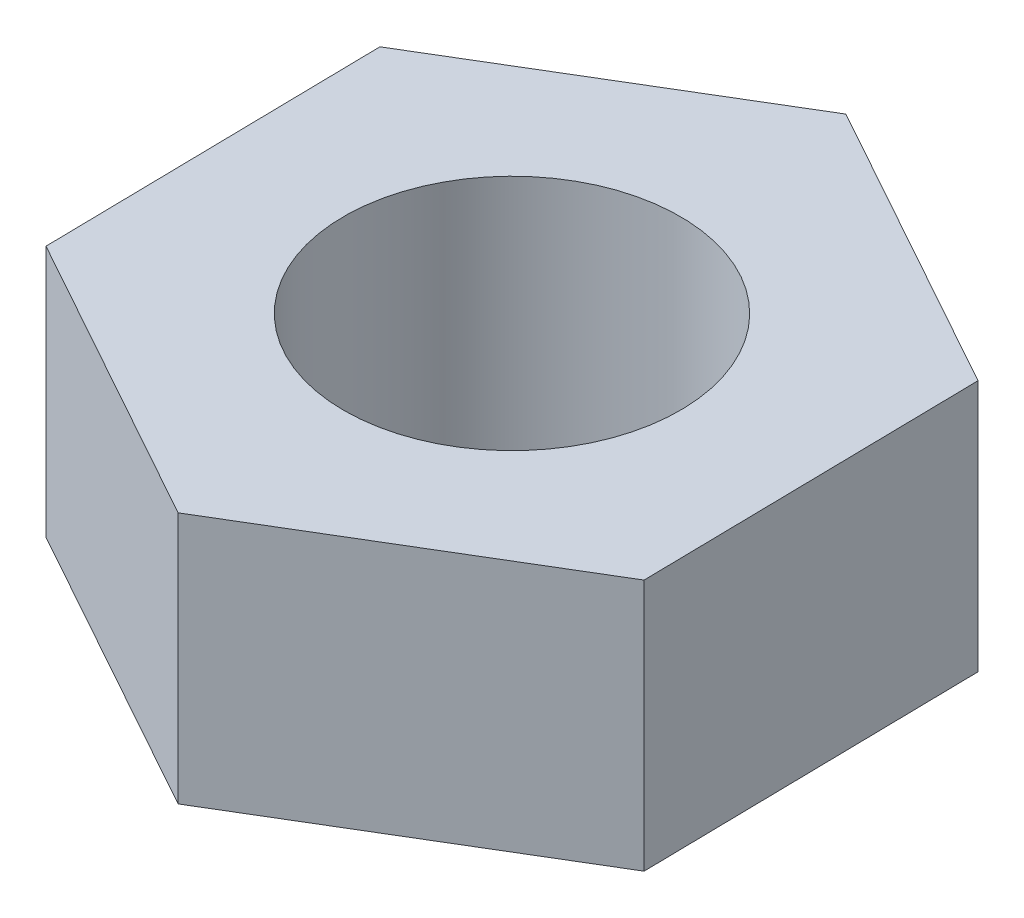
ISO-10303-21;
HEADER;
FILE_DESCRIPTION(('STEP AP214'),'2;1');
FILE_NAME('part.step','',(''),(''),'','','');
FILE_SCHEMA(('AUTOMOTIVE_DESIGN { 1 0 10303 214 1 1 1 1 }'));
ENDSEC;
DATA;
#1=APPLICATION_CONTEXT('core data for automotive mechanical design processes');
#2=APPLICATION_PROTOCOL_DEFINITION('international standard','automotive_design',2000,#1);
#3=PRODUCT_CONTEXT('',#1,'mechanical');
#4=PRODUCT('Part','Part','',(#3));
#5=PRODUCT_RELATED_PRODUCT_CATEGORY('part','',(#4));
#6=PRODUCT_DEFINITION_FORMATION('','',#4);
#7=PRODUCT_DEFINITION_CONTEXT('part definition',#1,'design');
#8=PRODUCT_DEFINITION('design','',#6,#7);
#9=PRODUCT_DEFINITION_SHAPE('','',#8);
#10=(LENGTH_UNIT() NAMED_UNIT(*) SI_UNIT(.MILLI.,.METRE.));
#11=(NAMED_UNIT(*) PLANE_ANGLE_UNIT() SI_UNIT($,.RADIAN.));
#12=(NAMED_UNIT(*) SI_UNIT($,.STERADIAN.) SOLID_ANGLE_UNIT());
#13=UNCERTAINTY_MEASURE_WITH_UNIT(LENGTH_MEASURE(1.E-05),#10,'distance_accuracy_value','');
#14=(GEOMETRIC_REPRESENTATION_CONTEXT(3) GLOBAL_UNCERTAINTY_ASSIGNED_CONTEXT((#13)) GLOBAL_UNIT_ASSIGNED_CONTEXT((#10,
#11,#12)) REPRESENTATION_CONTEXT('',''));
#15=CARTESIAN_POINT('',(0.,0.,0.));
#16=DIRECTION('',(0.,0.,1.));
#17=DIRECTION('',(1.,0.,0.));
#18=AXIS2_PLACEMENT_3D('',#15,#16,#17);
#19=CARTESIAN_POINT('',(0.,3.,0.));
#20=DIRECTION('',(0.,1.,0.));
#21=DIRECTION('',(0.,0.,1.));
#22=AXIS2_PLACEMENT_3D('',#19,#20,#21);
#23=PLANE('',#22);
#24=DIRECTION('',(-0.0168199314832371,0.,-0.999858534946269));
#25=VECTOR('',#24,1.);
#26=CARTESIAN_POINT('',(3.53349334420553,3.,1.96157031986838));
#27=LINE('',#26,#25);
#28=CARTESIAN_POINT('',(3.53349334420553,3.,1.96157031986838));
#29=VERTEX_POINT('',#28);
#30=CARTESIAN_POINT('',(3.46551640041835,3.,-2.07930984025104));
#31=VERTEX_POINT('',#30);
#32=EDGE_CURVE('E146',#29,#31,#27,.T.);
#33=ORIENTED_EDGE('',*,*,#32,.T.);
#34=DIRECTION('',(-0.874312857195778,0.,-0.485362779518738));
#35=VECTOR('',#34,1.);
#36=CARTESIAN_POINT('',(3.46551640041835,3.,-2.07930984025104));
#37=LINE('',#36,#35);
#38=CARTESIAN_POINT('',(-0.0679769437871851,3.,-4.04088016011941));
#39=VERTEX_POINT('',#38);
#40=EDGE_CURVE('E94',#31,#39,#37,.T.);
#41=ORIENTED_EDGE('',*,*,#40,.T.);
#42=DIRECTION('',(-0.857492925712541,0.,0.514495755427532));
#43=VECTOR('',#42,1.);
#44=CARTESIAN_POINT('',(-0.0679769437871851,3.,-4.04088016011941));
#45=LINE('',#44,#43);
#46=CARTESIAN_POINT('',(-3.53349334420553,3.,-1.96157031986838));
#47=VERTEX_POINT('',#46);
#48=EDGE_CURVE('E107',#39,#47,#45,.T.);
#49=ORIENTED_EDGE('',*,*,#48,.T.);
#50=DIRECTION('',(0.0168199314832372,0.,0.999858534946269));
#51=VECTOR('',#50,1.);
#52=CARTESIAN_POINT('',(-3.53349334420553,3.,-1.96157031986838));
#53=LINE('',#52,#51);
#54=CARTESIAN_POINT('',(-3.46551640041835,3.,2.07930984025104));
#55=VERTEX_POINT('',#54);
#56=EDGE_CURVE('E101',#47,#55,#53,.T.);
#57=ORIENTED_EDGE('',*,*,#56,.T.);
#58=DIRECTION('',(0.874312857195778,0.,0.485362779518737));
#59=VECTOR('',#58,1.);
#60=CARTESIAN_POINT('',(-3.46551640041835,3.,2.07930984025104));
#61=LINE('',#60,#59);
#62=CARTESIAN_POINT('',(0.0679769437871848,3.,4.04088016011941));
#63=VERTEX_POINT('',#62);
#64=EDGE_CURVE('E105',#55,#63,#61,.T.);
#65=ORIENTED_EDGE('',*,*,#64,.T.);
#66=DIRECTION('',(0.857492925712541,0.,-0.514495755427532));
#67=VECTOR('',#66,1.);
#68=CARTESIAN_POINT('',(0.0679769437871848,3.,4.04088016011941));
#69=LINE('',#68,#67);
#70=EDGE_CURVE('E57',#63,#29,#69,.T.);
#71=ORIENTED_EDGE('',*,*,#70,.T.);
#72=EDGE_LOOP('',(#33,#41,#49,#57,#65,#71));
#73=FACE_BOUND('',#72,.T.);
#74=CARTESIAN_POINT('',(0.,3.,0.));
#75=DIRECTION('',(0.,1.,0.));
#76=DIRECTION('',(0.,0.,1.));
#77=AXIS2_PLACEMENT_3D('',#74,#75,#76);
#78=CIRCLE('',#77,2.);
#79=CARTESIAN_POINT('',(0.,3.,2.));
#80=VERTEX_POINT('',#79);
#81=EDGE_CURVE('E134',#80,#80,#78,.T.);
#82=ORIENTED_EDGE('',*,*,#81,.F.);
#83=EDGE_LOOP('',(#82));
#84=FACE_BOUND('',#83,.T.);
#85=ADVANCED_FACE('F39',(#73,#84),#23,.T.);
#86=CARTESIAN_POINT('',(0.,0.,0.));
#87=DIRECTION('',(0.,1.,0.));
#88=DIRECTION('',(0.,0.,1.));
#89=AXIS2_PLACEMENT_3D('',#86,#87,#88);
#90=PLANE('',#89);
#91=DIRECTION('',(-0.0168199314832371,0.,-0.999858534946269));
#92=VECTOR('',#91,1.);
#93=CARTESIAN_POINT('',(3.53349334420553,0.,1.96157031986838));
#94=LINE('',#93,#92);
#95=CARTESIAN_POINT('',(3.53349334420553,0.,1.96157031986838));
#96=VERTEX_POINT('',#95);
#97=CARTESIAN_POINT('',(3.46551640041835,0.,-2.07930984025104));
#98=VERTEX_POINT('',#97);
#99=EDGE_CURVE('E129',#96,#98,#94,.T.);
#100=ORIENTED_EDGE('',*,*,#99,.F.);
#101=DIRECTION('',(0.857492925712541,0.,-0.514495755427532));
#102=VECTOR('',#101,1.);
#103=CARTESIAN_POINT('',(0.0679769437871848,0.,4.04088016011941));
#104=LINE('',#103,#102);
#105=CARTESIAN_POINT('',(0.0679769437871848,0.,4.04088016011941));
#106=VERTEX_POINT('',#105);
#107=EDGE_CURVE('E86',#106,#96,#104,.T.);
#108=ORIENTED_EDGE('',*,*,#107,.F.);
#109=DIRECTION('',(0.874312857195778,0.,0.485362779518737));
#110=VECTOR('',#109,1.);
#111=CARTESIAN_POINT('',(-3.46551640041835,0.,2.07930984025104));
#112=LINE('',#111,#110);
#113=CARTESIAN_POINT('',(-3.46551640041835,0.,2.07930984025104));
#114=VERTEX_POINT('',#113);
#115=EDGE_CURVE('E80',#114,#106,#112,.T.);
#116=ORIENTED_EDGE('',*,*,#115,.F.);
#117=DIRECTION('',(0.0168199314832372,0.,0.999858534946269));
#118=VECTOR('',#117,1.);
#119=CARTESIAN_POINT('',(-3.53349334420553,0.,-1.96157031986838));
#120=LINE('',#119,#118);
#121=CARTESIAN_POINT('',(-3.53349334420553,0.,-1.96157031986838));
#122=VERTEX_POINT('',#121);
#123=EDGE_CURVE('E116',#122,#114,#120,.T.);
#124=ORIENTED_EDGE('',*,*,#123,.F.);
#125=DIRECTION('',(-0.857492925712541,0.,0.514495755427532));
#126=VECTOR('',#125,1.);
#127=CARTESIAN_POINT('',(-0.0679769437871851,0.,-4.04088016011941));
#128=LINE('',#127,#126);
#129=CARTESIAN_POINT('',(-0.0679769437871851,0.,-4.04088016011941));
#130=VERTEX_POINT('',#129);
#131=EDGE_CURVE('E137',#130,#122,#128,.T.);
#132=ORIENTED_EDGE('',*,*,#131,.F.);
#133=DIRECTION('',(-0.874312857195778,0.,-0.485362779518738));
#134=VECTOR('',#133,1.);
#135=CARTESIAN_POINT('',(3.46551640041835,0.,-2.07930984025104));
#136=LINE('',#135,#134);
#137=EDGE_CURVE('E133',#98,#130,#136,.T.);
#138=ORIENTED_EDGE('',*,*,#137,.F.);
#139=EDGE_LOOP('',(#100,#108,#116,#124,#132,#138));
#140=FACE_BOUND('',#139,.T.);
#141=CARTESIAN_POINT('',(0.,0.,0.));
#142=DIRECTION('',(0.,1.,0.));
#143=DIRECTION('',(0.,0.,1.));
#144=AXIS2_PLACEMENT_3D('',#141,#142,#143);
#145=CIRCLE('',#144,2.);
#146=CARTESIAN_POINT('',(0.,0.,2.));
#147=VERTEX_POINT('',#146);
#148=EDGE_CURVE('E243',#147,#147,#145,.T.);
#149=ORIENTED_EDGE('',*,*,#148,.T.);
#150=EDGE_LOOP('',(#149));
#151=FACE_BOUND('',#150,.T.);
#152=ADVANCED_FACE('F159',(#140,#151),#90,.F.);
#153=CARTESIAN_POINT('',(3.53349334420553,3.,1.96157031986838));
#154=DIRECTION('',(-0.999858534946269,0.,0.0168199314832371));
#155=DIRECTION('',(0.0168199314832371,0.,0.999858534946269));
#156=AXIS2_PLACEMENT_3D('',#153,#154,#155);
#157=PLANE('',#156);
#158=ORIENTED_EDGE('',*,*,#99,.T.);
#159=DIRECTION('',(0.,-1.,0.));
#160=VECTOR('',#159,1.);
#161=CARTESIAN_POINT('',(3.46551640041835,3.,-2.07930984025104));
#162=LINE('',#161,#160);
#163=EDGE_CURVE('E11',#31,#98,#162,.T.);
#164=ORIENTED_EDGE('',*,*,#163,.F.);
#165=ORIENTED_EDGE('',*,*,#32,.F.);
#166=DIRECTION('',(0.,-1.,0.));
#167=VECTOR('',#166,1.);
#168=CARTESIAN_POINT('',(3.53349334420553,3.,1.96157031986838));
#169=LINE('',#168,#167);
#170=EDGE_CURVE('E125',#29,#96,#169,.T.);
#171=ORIENTED_EDGE('',*,*,#170,.T.);
#172=EDGE_LOOP('',(#158,#164,#165,#171));
#173=FACE_BOUND('',#172,.T.);
#174=ADVANCED_FACE('F41',(#173),#157,.F.);
#175=CARTESIAN_POINT('',(3.46551640041835,3.,-2.07930984025104));
#176=DIRECTION('',(-0.485362779518738,0.,0.874312857195778));
#177=DIRECTION('',(0.874312857195778,0.,0.485362779518738));
#178=AXIS2_PLACEMENT_3D('',#175,#176,#177);
#179=PLANE('',#178);
#180=ORIENTED_EDGE('',*,*,#137,.T.);
#181=DIRECTION('',(0.,-1.,0.));
#182=VECTOR('',#181,1.);
#183=CARTESIAN_POINT('',(-0.0679769437871851,3.,-4.04088016011941));
#184=LINE('',#183,#182);
#185=EDGE_CURVE('E49',#39,#130,#184,.T.);
#186=ORIENTED_EDGE('',*,*,#185,.F.);
#187=ORIENTED_EDGE('',*,*,#40,.F.);
#188=ORIENTED_EDGE('',*,*,#163,.T.);
#189=EDGE_LOOP('',(#180,#186,#187,#188));
#190=FACE_BOUND('',#189,.T.);
#191=ADVANCED_FACE('F184',(#190),#179,.F.);
#192=CARTESIAN_POINT('',(-0.0679769437871851,3.,-4.04088016011941));
#193=DIRECTION('',(0.514495755427532,0.,0.857492925712541));
#194=DIRECTION('',(0.857492925712541,0.,-0.514495755427532));
#195=AXIS2_PLACEMENT_3D('',#192,#193,#194);
#196=PLANE('',#195);
#197=ORIENTED_EDGE('',*,*,#131,.T.);
#198=DIRECTION('',(0.,-1.,0.));
#199=VECTOR('',#198,1.);
#200=CARTESIAN_POINT('',(-3.53349334420553,3.,-1.96157031986838));
#201=LINE('',#200,#199);
#202=EDGE_CURVE('E118',#47,#122,#201,.T.);
#203=ORIENTED_EDGE('',*,*,#202,.F.);
#204=ORIENTED_EDGE('',*,*,#48,.F.);
#205=ORIENTED_EDGE('',*,*,#185,.T.);
#206=EDGE_LOOP('',(#197,#203,#204,#205));
#207=FACE_BOUND('',#206,.T.);
#208=ADVANCED_FACE('F156',(#207),#196,.F.);
#209=CARTESIAN_POINT('',(-3.53349334420553,3.,-1.96157031986838));
#210=DIRECTION('',(0.999858534946269,0.,-0.0168199314832372));
#211=DIRECTION('',(-0.0168199314832372,0.,-0.999858534946269));
#212=AXIS2_PLACEMENT_3D('',#209,#210,#211);
#213=PLANE('',#212);
#214=ORIENTED_EDGE('',*,*,#123,.T.);
#215=DIRECTION('',(0.,-1.,0.));
#216=VECTOR('',#215,1.);
#217=CARTESIAN_POINT('',(-3.46551640041835,3.,2.07930984025104));
#218=LINE('',#217,#216);
#219=EDGE_CURVE('E113',#55,#114,#218,.T.);
#220=ORIENTED_EDGE('',*,*,#219,.F.);
#221=ORIENTED_EDGE('',*,*,#56,.F.);
#222=ORIENTED_EDGE('',*,*,#202,.T.);
#223=EDGE_LOOP('',(#214,#220,#221,#222));
#224=FACE_BOUND('',#223,.T.);
#225=ADVANCED_FACE('F114',(#224),#213,.F.);
#226=CARTESIAN_POINT('',(-3.46551640041835,3.,2.07930984025104));
#227=DIRECTION('',(0.485362779518738,0.,-0.874312857195778));
#228=DIRECTION('',(-0.874312857195778,0.,-0.485362779518738));
#229=AXIS2_PLACEMENT_3D('',#226,#227,#228);
#230=PLANE('',#229);
#231=ORIENTED_EDGE('',*,*,#115,.T.);
#232=DIRECTION('',(0.,-1.,0.));
#233=VECTOR('',#232,1.);
#234=CARTESIAN_POINT('',(0.0679769437871848,3.,4.04088016011941));
#235=LINE('',#234,#233);
#236=EDGE_CURVE('E119',#63,#106,#235,.T.);
#237=ORIENTED_EDGE('',*,*,#236,.F.);
#238=ORIENTED_EDGE('',*,*,#64,.F.);
#239=ORIENTED_EDGE('',*,*,#219,.T.);
#240=EDGE_LOOP('',(#231,#237,#238,#239));
#241=FACE_BOUND('',#240,.T.);
#242=ADVANCED_FACE('F121',(#241),#230,.F.);
#243=CARTESIAN_POINT('',(0.0679769437871848,3.,4.04088016011941));
#244=DIRECTION('',(-0.514495755427531,0.,-0.857492925712541));
#245=DIRECTION('',(-0.857492925712541,0.,0.514495755427531));
#246=AXIS2_PLACEMENT_3D('',#243,#244,#245);
#247=PLANE('',#246);
#248=ORIENTED_EDGE('',*,*,#107,.T.);
#249=ORIENTED_EDGE('',*,*,#170,.F.);
#250=ORIENTED_EDGE('',*,*,#70,.F.);
#251=ORIENTED_EDGE('',*,*,#236,.T.);
#252=EDGE_LOOP('',(#248,#249,#250,#251));
#253=FACE_BOUND('',#252,.T.);
#254=ADVANCED_FACE('F164',(#253),#247,.F.);
#255=CARTESIAN_POINT('',(0.,3.,0.));
#256=DIRECTION('',(0.,-1.,0.));
#257=DIRECTION('',(0.,0.,-1.));
#258=AXIS2_PLACEMENT_3D('',#255,#256,#257);
#259=CYLINDRICAL_SURFACE('',#258,2.);
#260=ORIENTED_EDGE('',*,*,#81,.T.);
#261=EDGE_LOOP('',(#260));
#262=FACE_BOUND('',#261,.T.);
#263=ORIENTED_EDGE('',*,*,#148,.F.);
#264=EDGE_LOOP('',(#263));
#265=FACE_BOUND('',#264,.T.);
#266=ADVANCED_FACE('F166',(#262,#265),#259,.F.);
#267=CLOSED_SHELL('',(#85,#152,#174,#191,#208,#225,#242,#254,#266));
#268=MANIFOLD_SOLID_BREP('B2',#267);
#269=ADVANCED_BREP_SHAPE_REPRESENTATION('',(#18,#268),#14);
#270=SHAPE_DEFINITION_REPRESENTATION(#9,#269);
ENDSEC;
END-ISO-10303-21;
